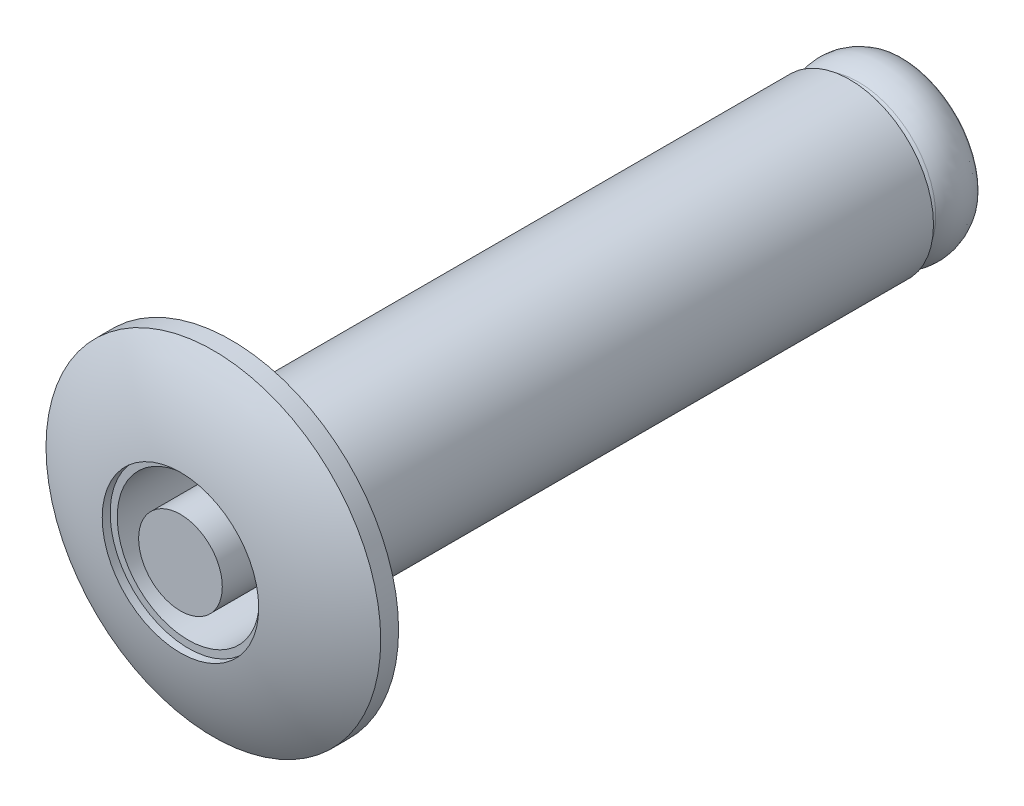
ISO-10303-21;
HEADER;
FILE_DESCRIPTION(('STEP AP214'),'2;1');
FILE_NAME('part.step','',(''),(''),'','','');
FILE_SCHEMA(('AUTOMOTIVE_DESIGN { 1 0 10303 214 1 1 1 1 }'));
ENDSEC;
DATA;
#1=APPLICATION_CONTEXT('core data for automotive mechanical design processes');
#2=APPLICATION_PROTOCOL_DEFINITION('international standard','automotive_design',2000,#1);
#3=PRODUCT_CONTEXT('',#1,'mechanical');
#4=PRODUCT('Part','Part','',(#3));
#5=PRODUCT_RELATED_PRODUCT_CATEGORY('part','',(#4));
#6=PRODUCT_DEFINITION_FORMATION('','',#4);
#7=PRODUCT_DEFINITION_CONTEXT('part definition',#1,'design');
#8=PRODUCT_DEFINITION('design','',#6,#7);
#9=PRODUCT_DEFINITION_SHAPE('','',#8);
#10=(LENGTH_UNIT() NAMED_UNIT(*) SI_UNIT(.MILLI.,.METRE.));
#11=(NAMED_UNIT(*) PLANE_ANGLE_UNIT() SI_UNIT($,.RADIAN.));
#12=(NAMED_UNIT(*) SI_UNIT($,.STERADIAN.) SOLID_ANGLE_UNIT());
#13=UNCERTAINTY_MEASURE_WITH_UNIT(LENGTH_MEASURE(1.E-05),#10,'distance_accuracy_value','');
#14=(GEOMETRIC_REPRESENTATION_CONTEXT(3) GLOBAL_UNCERTAINTY_ASSIGNED_CONTEXT((#13)) GLOBAL_UNIT_ASSIGNED_CONTEXT((#10,
#11,#12)) REPRESENTATION_CONTEXT('',''));
#15=CARTESIAN_POINT('',(0.,0.,0.));
#16=DIRECTION('',(0.,0.,1.));
#17=DIRECTION('',(1.,0.,0.));
#18=AXIS2_PLACEMENT_3D('',#15,#16,#17);
#19=CARTESIAN_POINT('',(0.,0.,0.));
#20=DIRECTION('',(0.,0.,1.));
#21=DIRECTION('',(1.,0.,0.));
#22=AXIS2_PLACEMENT_3D('',#19,#20,#21);
#23=CYLINDRICAL_SURFACE('',#22,1.349375);
#24=CARTESIAN_POINT('',(0.,0.,-11.7348));
#25=DIRECTION('',(0.,0.,1.));
#26=DIRECTION('',(1.,0.,0.));
#27=AXIS2_PLACEMENT_3D('',#24,#25,#26);
#28=CIRCLE('',#27,1.349375);
#29=CARTESIAN_POINT('',(1.349375,0.,-11.7348));
#30=VERTEX_POINT('',#29);
#31=EDGE_CURVE('E55',#30,#30,#28,.T.);
#32=ORIENTED_EDGE('',*,*,#31,.F.);
#33=EDGE_LOOP('',(#32));
#34=FACE_BOUND('',#33,.T.);
#35=CARTESIAN_POINT('',(0.,0.,0.8128));
#36=DIRECTION('',(0.,0.,1.));
#37=DIRECTION('',(1.,0.,0.));
#38=AXIS2_PLACEMENT_3D('',#35,#36,#37);
#39=CIRCLE('',#38,1.349375);
#40=CARTESIAN_POINT('',(1.349375,0.,0.8128));
#41=VERTEX_POINT('',#40);
#42=EDGE_CURVE('E66',#41,#41,#39,.F.);
#43=ORIENTED_EDGE('',*,*,#42,.F.);
#44=EDGE_LOOP('',(#43));
#45=FACE_BOUND('',#44,.T.);
#46=ADVANCED_FACE('F44',(#34,#45),#23,.F.);
#47=CARTESIAN_POINT('',(0.,0.,-3.50845768229166));
#48=DIRECTION('',(0.,0.,1.));
#49=DIRECTION('',(1.,0.,0.));
#50=AXIS2_PLACEMENT_3D('',#47,#48,#49);
#51=DEGENERATE_TOROIDAL_SURFACE('',#50,0.79375,4.52445768229166,.T.);
#52=CARTESIAN_POINT('',(0.,0.,0.962989594870598));
#53=DIRECTION('',(0.,0.,-1.));
#54=DIRECTION('',(-1.,0.,0.));
#55=AXIS2_PLACEMENT_3D('',#52,#53,#54);
#56=CIRCLE('',#55,1.4843125);
#57=CARTESIAN_POINT('',(-1.4843125,0.,0.962989594870598));
#58=VERTEX_POINT('',#57);
#59=EDGE_CURVE('E62',#58,#58,#56,.T.);
#60=ORIENTED_EDGE('',*,*,#59,.T.);
#61=EDGE_LOOP('',(#60));
#62=FACE_BOUND('',#61,.T.);
#63=CARTESIAN_POINT('',(0.,0.,0.338666666666666));
#64=DIRECTION('',(0.,0.,1.));
#65=DIRECTION('',(1.,0.,0.));
#66=AXIS2_PLACEMENT_3D('',#63,#64,#65);
#67=CIRCLE('',#66,3.175);
#68=CARTESIAN_POINT('',(3.175,0.,0.338666666666666));
#69=VERTEX_POINT('',#68);
#70=EDGE_CURVE('E65',#69,#69,#67,.T.);
#71=ORIENTED_EDGE('',*,*,#70,.T.);
#72=EDGE_LOOP('',(#71));
#73=FACE_BOUND('',#72,.T.);
#74=ADVANCED_FACE('F90',(#62,#73),#51,.T.);
#75=CARTESIAN_POINT('',(0.,1.5875,-11.7348));
#76=DIRECTION('',(0.,0.,1.));
#77=DIRECTION('',(1.,0.,0.));
#78=AXIS2_PLACEMENT_3D('',#75,#76,#77);
#79=PLANE('',#78);
#80=CARTESIAN_POINT('',(0.,0.,-11.7348));
#81=DIRECTION('',(0.,0.,1.));
#82=DIRECTION('',(1.,0.,0.));
#83=AXIS2_PLACEMENT_3D('',#80,#81,#82);
#84=CIRCLE('',#83,1.5875);
#85=CARTESIAN_POINT('',(1.5875,0.,-11.7348));
#86=VERTEX_POINT('',#85);
#87=EDGE_CURVE('E59',#86,#86,#84,.T.);
#88=ORIENTED_EDGE('',*,*,#87,.F.);
#89=EDGE_LOOP('',(#88));
#90=FACE_BOUND('',#89,.T.);
#91=ORIENTED_EDGE('',*,*,#31,.T.);
#92=EDGE_LOOP('',(#91));
#93=FACE_BOUND('',#92,.T.);
#94=ADVANCED_FACE('F93',(#90,#93),#79,.F.);
#95=CARTESIAN_POINT('',(0.,0.,0.));
#96=DIRECTION('',(0.,0.,1.));
#97=DIRECTION('',(1.,0.,0.));
#98=AXIS2_PLACEMENT_3D('',#95,#96,#97);
#99=CYLINDRICAL_SURFACE('',#98,1.5875);
#100=CARTESIAN_POINT('',(0.,0.,-0.254));
#101=DIRECTION('',(0.,0.,1.));
#102=DIRECTION('',(1.,0.,0.));
#103=AXIS2_PLACEMENT_3D('',#100,#101,#102);
#104=CIRCLE('',#103,1.5875);
#105=CARTESIAN_POINT('',(1.5875,0.,-0.254));
#106=VERTEX_POINT('',#105);
#107=EDGE_CURVE('E11',#106,#106,#104,.F.);
#108=ORIENTED_EDGE('',*,*,#107,.T.);
#109=EDGE_LOOP('',(#108));
#110=FACE_BOUND('',#109,.T.);
#111=ORIENTED_EDGE('',*,*,#87,.T.);
#112=EDGE_LOOP('',(#111));
#113=FACE_BOUND('',#112,.T.);
#114=ADVANCED_FACE('F103',(#110,#113),#99,.T.);
#115=CARTESIAN_POINT('',(0.,3.175,0.));
#116=DIRECTION('',(0.,0.,1.));
#117=DIRECTION('',(1.,0.,0.));
#118=AXIS2_PLACEMENT_3D('',#115,#116,#117);
#119=PLANE('',#118);
#120=CARTESIAN_POINT('',(0.,0.,0.));
#121=DIRECTION('',(0.,0.,1.));
#122=DIRECTION('',(1.,0.,0.));
#123=AXIS2_PLACEMENT_3D('',#120,#121,#122);
#124=CIRCLE('',#123,1.8415);
#125=CARTESIAN_POINT('',(1.8415,0.,0.));
#126=VERTEX_POINT('',#125);
#127=EDGE_CURVE('E51',#126,#126,#124,.T.);
#128=ORIENTED_EDGE('',*,*,#127,.T.);
#129=EDGE_LOOP('',(#128));
#130=FACE_BOUND('',#129,.T.);
#131=CARTESIAN_POINT('',(0.,0.,0.));
#132=DIRECTION('',(0.,0.,1.));
#133=DIRECTION('',(1.,0.,0.));
#134=AXIS2_PLACEMENT_3D('',#131,#132,#133);
#135=CIRCLE('',#134,3.175);
#136=CARTESIAN_POINT('',(3.175,0.,0.));
#137=VERTEX_POINT('',#136);
#138=EDGE_CURVE('E72',#137,#137,#135,.T.);
#139=ORIENTED_EDGE('',*,*,#138,.F.);
#140=EDGE_LOOP('',(#139));
#141=FACE_BOUND('',#140,.T.);
#142=ADVANCED_FACE('F98',(#130,#141),#119,.F.);
#143=CARTESIAN_POINT('',(0.,0.,0.));
#144=DIRECTION('',(0.,0.,1.));
#145=DIRECTION('',(1.,0.,0.));
#146=AXIS2_PLACEMENT_3D('',#143,#144,#145);
#147=CYLINDRICAL_SURFACE('',#146,3.175);
#148=ORIENTED_EDGE('',*,*,#70,.F.);
#149=EDGE_LOOP('',(#148));
#150=FACE_BOUND('',#149,.T.);
#151=ORIENTED_EDGE('',*,*,#138,.T.);
#152=EDGE_LOOP('',(#151));
#153=FACE_BOUND('',#152,.T.);
#154=ADVANCED_FACE('F86',(#150,#153),#147,.T.);
#155=CARTESIAN_POINT('',(0.,0.,0.8128));
#156=DIRECTION('',(0.,0.,1.));
#157=DIRECTION('',(1.,0.,0.));
#158=AXIS2_PLACEMENT_3D('',#155,#156,#157);
#159=CYLINDRICAL_SURFACE('',#158,1.4843125);
#160=CARTESIAN_POINT('',(0.,0.,0.8128));
#161=DIRECTION('',(0.,0.,1.));
#162=DIRECTION('',(1.,0.,0.));
#163=AXIS2_PLACEMENT_3D('',#160,#161,#162);
#164=CIRCLE('',#163,1.4843125);
#165=CARTESIAN_POINT('',(1.4843125,0.,0.8128));
#166=VERTEX_POINT('',#165);
#167=EDGE_CURVE('E68',#166,#166,#164,.T.);
#168=ORIENTED_EDGE('',*,*,#167,.F.);
#169=EDGE_LOOP('',(#168));
#170=FACE_BOUND('',#169,.T.);
#171=ORIENTED_EDGE('',*,*,#59,.F.);
#172=EDGE_LOOP('',(#171));
#173=FACE_BOUND('',#172,.T.);
#174=ADVANCED_FACE('F83',(#170,#173),#159,.F.);
#175=CARTESIAN_POINT('',(0.,0.,0.8128));
#176=DIRECTION('',(0.,0.,1.));
#177=DIRECTION('',(1.,0.,0.));
#178=AXIS2_PLACEMENT_3D('',#175,#176,#177);
#179=PLANE('',#178);
#180=ORIENTED_EDGE('',*,*,#167,.T.);
#181=EDGE_LOOP('',(#180));
#182=FACE_BOUND('',#181,.T.);
#183=ORIENTED_EDGE('',*,*,#42,.T.);
#184=EDGE_LOOP('',(#183));
#185=FACE_BOUND('',#184,.T.);
#186=ADVANCED_FACE('F80',(#182,#185),#179,.T.);
#187=CARTESIAN_POINT('',(0.,0.,-0.254));
#188=DIRECTION('',(0.,0.,1.));
#189=DIRECTION('',(1.,0.,0.));
#190=AXIS2_PLACEMENT_3D('',#187,#188,#189);
#191=TOROIDAL_SURFACE('',#190,1.8415,0.254);
#192=ORIENTED_EDGE('',*,*,#107,.F.);
#193=EDGE_LOOP('',(#192));
#194=FACE_BOUND('',#193,.T.);
#195=ORIENTED_EDGE('',*,*,#127,.F.);
#196=EDGE_LOOP('',(#195));
#197=FACE_BOUND('',#196,.T.);
#198=ADVANCED_FACE('F46',(#194,#197),#191,.F.);
#199=CLOSED_SHELL('',(#46,#74,#94,#114,#142,#154,#174,#186,#198));
#200=MANIFOLD_SOLID_BREP('B2',#199);
#201=CARTESIAN_POINT('',(0.,1.42875,-12.7508));
#202=DIRECTION('',(0.,0.,1.));
#203=DIRECTION('',(1.,0.,0.));
#204=AXIS2_PLACEMENT_3D('',#201,#202,#203);
#205=PLANE('',#204);
#206=CARTESIAN_POINT('',(0.,0.,-12.7508));
#207=DIRECTION('',(0.,0.,1.));
#208=DIRECTION('',(1.,0.,0.));
#209=AXIS2_PLACEMENT_3D('',#206,#207,#208);
#210=CIRCLE('',#209,1.36354194727756);
#211=CARTESIAN_POINT('',(1.36354194727756,0.,-12.7508));
#212=VERTEX_POINT('',#211);
#213=EDGE_CURVE('E43',#212,#212,#210,.F.);
#214=ORIENTED_EDGE('',*,*,#213,.T.);
#215=EDGE_LOOP('',(#214));
#216=FACE_BOUND('',#215,.T.);
#217=ADVANCED_FACE('F180',(#216),#205,.F.);
#218=CARTESIAN_POINT('',(0.,0.,-12.2936));
#219=DIRECTION('',(0.,0.,1.));
#220=DIRECTION('',(1.,0.,0.));
#221=AXIS2_PLACEMENT_3D('',#218,#219,#220);
#222=TOROIDAL_SURFACE('',#221,0.849757000000001,0.737742999999999);
#223=CARTESIAN_POINT('',(0.,0.,-11.8947370763152));
#224=DIRECTION('',(0.,0.,-1.));
#225=DIRECTION('',(-1.,0.,0.));
#226=AXIS2_PLACEMENT_3D('',#223,#224,#225);
#227=CIRCLE('',#226,1.47038015631843);
#228=CARTESIAN_POINT('',(-1.47038015631843,0.,-11.8947370763152));
#229=VERTEX_POINT('',#228);
#230=EDGE_CURVE('E188',#229,#229,#227,.T.);
#231=ORIENTED_EDGE('',*,*,#230,.T.);
#232=EDGE_LOOP('',(#231));
#233=FACE_BOUND('',#232,.T.);
#234=CARTESIAN_POINT('',(0.,0.,-12.6924629236848));
#235=DIRECTION('',(0.,0.,1.));
#236=DIRECTION('',(1.,0.,0.));
#237=AXIS2_PLACEMENT_3D('',#234,#235,#236);
#238=CIRCLE('',#237,1.47038015631843);
#239=CARTESIAN_POINT('',(1.47038015631843,0.,-12.6924629236848));
#240=VERTEX_POINT('',#239);
#241=EDGE_CURVE('E192',#240,#240,#238,.T.);
#242=ORIENTED_EDGE('',*,*,#241,.T.);
#243=EDGE_LOOP('',(#242));
#244=FACE_BOUND('',#243,.T.);
#245=ADVANCED_FACE('F219',(#233,#244),#222,.T.);
#246=CARTESIAN_POINT('',(0.,0.79375,-11.8364));
#247=DIRECTION('',(0.,0.,-1.));
#248=DIRECTION('',(-1.,0.,0.));
#249=AXIS2_PLACEMENT_3D('',#246,#247,#248);
#250=PLANE('',#249);
#251=CARTESIAN_POINT('',(0.,0.,-11.8364));
#252=DIRECTION('',(0.,0.,-1.));
#253=DIRECTION('',(-1.,0.,0.));
#254=AXIS2_PLACEMENT_3D('',#251,#252,#253);
#255=CIRCLE('',#254,1.36354194727756);
#256=CARTESIAN_POINT('',(-1.36354194727756,0.,-11.8364));
#257=VERTEX_POINT('',#256);
#258=EDGE_CURVE('E197',#257,#257,#255,.F.);
#259=ORIENTED_EDGE('',*,*,#258,.T.);
#260=EDGE_LOOP('',(#259));
#261=FACE_BOUND('',#260,.T.);
#262=CARTESIAN_POINT('',(0.,0.,-11.8364));
#263=DIRECTION('',(0.,0.,1.));
#264=DIRECTION('',(1.,0.,0.));
#265=AXIS2_PLACEMENT_3D('',#262,#263,#264);
#266=CIRCLE('',#265,0.79375);
#267=CARTESIAN_POINT('',(0.79375,0.,-11.8364));
#268=VERTEX_POINT('',#267);
#269=EDGE_CURVE('E200',#268,#268,#266,.T.);
#270=ORIENTED_EDGE('',*,*,#269,.F.);
#271=EDGE_LOOP('',(#270));
#272=FACE_BOUND('',#271,.T.);
#273=ADVANCED_FACE('F224',(#261,#272),#250,.F.);
#274=CARTESIAN_POINT('',(0.,0.,24.4856));
#275=DIRECTION('',(0.,0.,1.));
#276=DIRECTION('',(1.,0.,0.));
#277=AXIS2_PLACEMENT_3D('',#274,#275,#276);
#278=CYLINDRICAL_SURFACE('',#277,0.79375);
#279=CARTESIAN_POINT('',(0.,0.,0.962989594870598));
#280=DIRECTION('',(0.,0.,-1.));
#281=DIRECTION('',(-1.,0.,0.));
#282=AXIS2_PLACEMENT_3D('',#279,#280,#281);
#283=CIRCLE('',#282,0.79375);
#284=CARTESIAN_POINT('',(-0.79375,0.,0.962989594870598));
#285=VERTEX_POINT('',#284);
#286=EDGE_CURVE('E184',#285,#285,#283,.T.);
#287=ORIENTED_EDGE('',*,*,#286,.T.);
#288=EDGE_LOOP('',(#287));
#289=FACE_BOUND('',#288,.T.);
#290=ORIENTED_EDGE('',*,*,#269,.T.);
#291=EDGE_LOOP('',(#290));
#292=FACE_BOUND('',#291,.T.);
#293=ADVANCED_FACE('F207',(#289,#292),#278,.T.);
#294=CARTESIAN_POINT('',(0.,0.,-11.9634));
#295=DIRECTION('',(0.,0.,-1.));
#296=DIRECTION('',(-1.,0.,0.));
#297=AXIS2_PLACEMENT_3D('',#294,#295,#296);
#298=TOROIDAL_SURFACE('',#297,1.36354194727756,0.127);
#299=ORIENTED_EDGE('',*,*,#230,.F.);
#300=EDGE_LOOP('',(#299));
#301=FACE_BOUND('',#300,.T.);
#302=ORIENTED_EDGE('',*,*,#258,.F.);
#303=EDGE_LOOP('',(#302));
#304=FACE_BOUND('',#303,.T.);
#305=ADVANCED_FACE('F215',(#301,#304),#298,.T.);
#306=CARTESIAN_POINT('',(0.,0.,-12.6238));
#307=DIRECTION('',(0.,0.,1.));
#308=DIRECTION('',(1.,0.,0.));
#309=AXIS2_PLACEMENT_3D('',#306,#307,#308);
#310=TOROIDAL_SURFACE('',#309,1.36354194727756,0.127);
#311=ORIENTED_EDGE('',*,*,#213,.F.);
#312=EDGE_LOOP('',(#311));
#313=FACE_BOUND('',#312,.T.);
#314=ORIENTED_EDGE('',*,*,#241,.F.);
#315=EDGE_LOOP('',(#314));
#316=FACE_BOUND('',#315,.T.);
#317=ADVANCED_FACE('F182',(#313,#316),#310,.T.);
#318=CARTESIAN_POINT('',(-3.175,1.5875,0.962989594870597));
#319=DIRECTION('',(0.,0.,-1.));
#320=DIRECTION('',(-1.,0.,0.));
#321=AXIS2_PLACEMENT_3D('',#318,#319,#320);
#322=PLANE('',#321);
#323=ORIENTED_EDGE('',*,*,#286,.F.);
#324=EDGE_LOOP('',(#323));
#325=FACE_BOUND('',#324,.T.);
#326=ADVANCED_FACE('F209',(#325),#322,.F.);
#327=CLOSED_SHELL('',(#217,#245,#273,#293,#305,#317,#326));
#328=MANIFOLD_SOLID_BREP('B6',#327);
#329=ADVANCED_BREP_SHAPE_REPRESENTATION('',(#18,#200,#328),#14);
#330=SHAPE_DEFINITION_REPRESENTATION(#9,#329);
ENDSEC;
END-ISO-10303-21;
